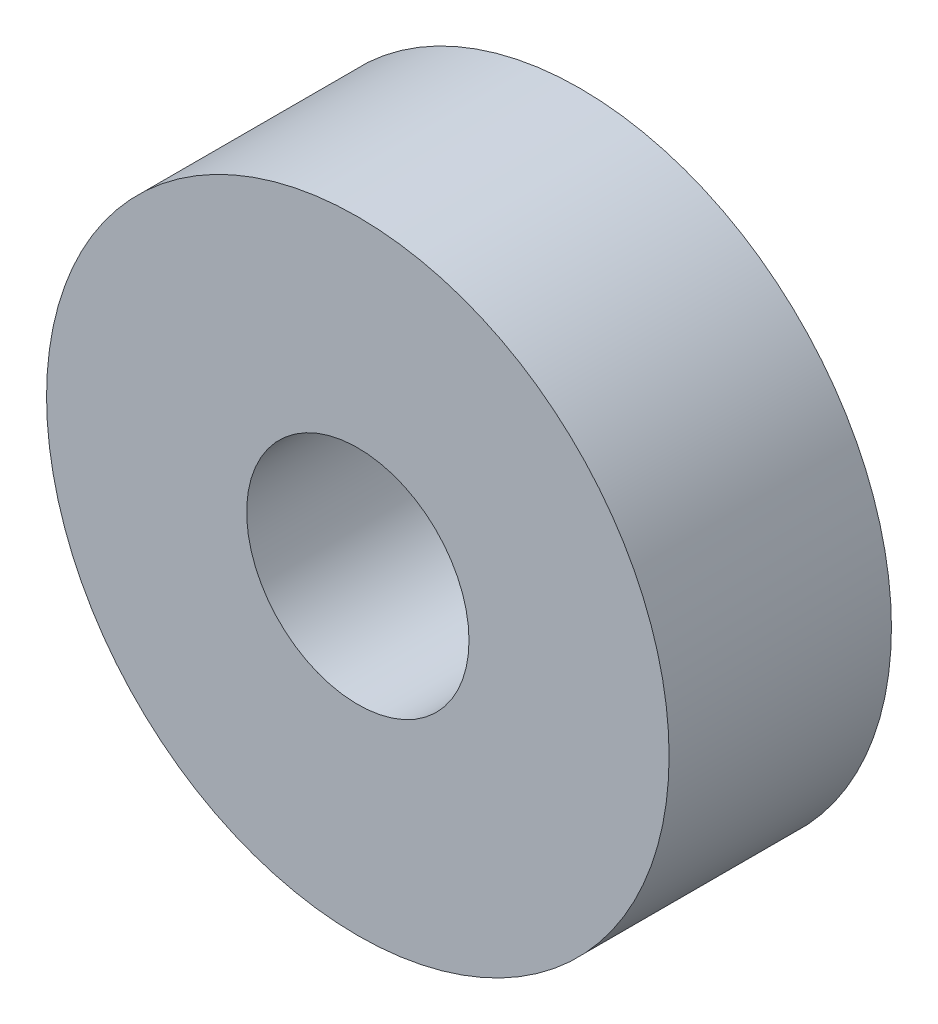
ISO-10303-21;
HEADER;
FILE_DESCRIPTION(('STEP AP214'),'2;1');
FILE_NAME('part.step','',(''),(''),'','','');
FILE_SCHEMA(('AUTOMOTIVE_DESIGN { 1 0 10303 214 1 1 1 1 }'));
ENDSEC;
DATA;
#1=APPLICATION_CONTEXT('core data for automotive mechanical design processes');
#2=APPLICATION_PROTOCOL_DEFINITION('international standard','automotive_design',2000,#1);
#3=PRODUCT_CONTEXT('',#1,'mechanical');
#4=PRODUCT('Part','Part','',(#3));
#5=PRODUCT_RELATED_PRODUCT_CATEGORY('part','',(#4));
#6=PRODUCT_DEFINITION_FORMATION('','',#4);
#7=PRODUCT_DEFINITION_CONTEXT('part definition',#1,'design');
#8=PRODUCT_DEFINITION('design','',#6,#7);
#9=PRODUCT_DEFINITION_SHAPE('','',#8);
#10=(LENGTH_UNIT() NAMED_UNIT(*) SI_UNIT(.MILLI.,.METRE.));
#11=(NAMED_UNIT(*) PLANE_ANGLE_UNIT() SI_UNIT($,.RADIAN.));
#12=(NAMED_UNIT(*) SI_UNIT($,.STERADIAN.) SOLID_ANGLE_UNIT());
#13=UNCERTAINTY_MEASURE_WITH_UNIT(LENGTH_MEASURE(1.E-05),#10,'distance_accuracy_value','');
#14=(GEOMETRIC_REPRESENTATION_CONTEXT(3) GLOBAL_UNCERTAINTY_ASSIGNED_CONTEXT((#13)) GLOBAL_UNIT_ASSIGNED_CONTEXT((#10,
#11,#12)) REPRESENTATION_CONTEXT('',''));
#15=CARTESIAN_POINT('',(0.,0.,0.));
#16=DIRECTION('',(0.,0.,1.));
#17=DIRECTION('',(1.,0.,0.));
#18=AXIS2_PLACEMENT_3D('',#15,#16,#17);
#19=CARTESIAN_POINT('',(0.,0.,5.));
#20=DIRECTION('',(0.,0.,1.));
#21=DIRECTION('',(1.,0.,0.));
#22=AXIS2_PLACEMENT_3D('',#19,#20,#21);
#23=PLANE('',#22);
#24=CARTESIAN_POINT('',(0.,0.,5.));
#25=DIRECTION('',(0.,0.,1.));
#26=DIRECTION('',(1.,0.,0.));
#27=AXIS2_PLACEMENT_3D('',#24,#25,#26);
#28=CIRCLE('',#27,7.);
#29=CARTESIAN_POINT('',(7.,0.,5.));
#30=VERTEX_POINT('',#29);
#31=EDGE_CURVE('E10',#30,#30,#28,.T.);
#32=ORIENTED_EDGE('',*,*,#31,.T.);
#33=EDGE_LOOP('',(#32));
#34=FACE_BOUND('',#33,.T.);
#35=CARTESIAN_POINT('',(0.,0.,5.));
#36=DIRECTION('',(0.,0.,1.));
#37=DIRECTION('',(1.,0.,0.));
#38=AXIS2_PLACEMENT_3D('',#35,#36,#37);
#39=CIRCLE('',#38,2.5);
#40=CARTESIAN_POINT('',(2.5,0.,5.));
#41=VERTEX_POINT('',#40);
#42=EDGE_CURVE('E44',#41,#41,#39,.T.);
#43=ORIENTED_EDGE('',*,*,#42,.F.);
#44=EDGE_LOOP('',(#43));
#45=FACE_BOUND('',#44,.T.);
#46=ADVANCED_FACE('F32',(#34,#45),#23,.T.);
#47=CARTESIAN_POINT('',(0.,0.,0.));
#48=DIRECTION('',(0.,0.,1.));
#49=DIRECTION('',(1.,0.,0.));
#50=AXIS2_PLACEMENT_3D('',#47,#48,#49);
#51=PLANE('',#50);
#52=CARTESIAN_POINT('',(0.,0.,0.));
#53=DIRECTION('',(0.,0.,1.));
#54=DIRECTION('',(1.,0.,0.));
#55=AXIS2_PLACEMENT_3D('',#52,#53,#54);
#56=CIRCLE('',#55,7.);
#57=CARTESIAN_POINT('',(7.,0.,0.));
#58=VERTEX_POINT('',#57);
#59=EDGE_CURVE('E36',#58,#58,#56,.T.);
#60=ORIENTED_EDGE('',*,*,#59,.F.);
#61=EDGE_LOOP('',(#60));
#62=FACE_BOUND('',#61,.T.);
#63=CARTESIAN_POINT('',(0.,0.,0.));
#64=DIRECTION('',(0.,0.,1.));
#65=DIRECTION('',(1.,0.,0.));
#66=AXIS2_PLACEMENT_3D('',#63,#64,#65);
#67=CIRCLE('',#66,2.5);
#68=CARTESIAN_POINT('',(2.5,0.,0.));
#69=VERTEX_POINT('',#68);
#70=EDGE_CURVE('E46',#69,#69,#67,.T.);
#71=ORIENTED_EDGE('',*,*,#70,.T.);
#72=EDGE_LOOP('',(#71));
#73=FACE_BOUND('',#72,.T.);
#74=ADVANCED_FACE('F56',(#62,#73),#51,.F.);
#75=CARTESIAN_POINT('',(0.,0.,5.));
#76=DIRECTION('',(0.,0.,-1.));
#77=DIRECTION('',(-1.,0.,0.));
#78=AXIS2_PLACEMENT_3D('',#75,#76,#77);
#79=CYLINDRICAL_SURFACE('',#78,7.);
#80=ORIENTED_EDGE('',*,*,#31,.F.);
#81=EDGE_LOOP('',(#80));
#82=FACE_BOUND('',#81,.T.);
#83=ORIENTED_EDGE('',*,*,#59,.T.);
#84=EDGE_LOOP('',(#83));
#85=FACE_BOUND('',#84,.T.);
#86=ADVANCED_FACE('F34',(#82,#85),#79,.T.);
#87=CARTESIAN_POINT('',(0.,0.,5.));
#88=DIRECTION('',(0.,0.,-1.));
#89=DIRECTION('',(-1.,0.,0.));
#90=AXIS2_PLACEMENT_3D('',#87,#88,#89);
#91=CYLINDRICAL_SURFACE('',#90,2.5);
#92=ORIENTED_EDGE('',*,*,#42,.T.);
#93=EDGE_LOOP('',(#92));
#94=FACE_BOUND('',#93,.T.);
#95=ORIENTED_EDGE('',*,*,#70,.F.);
#96=EDGE_LOOP('',(#95));
#97=FACE_BOUND('',#96,.T.);
#98=ADVANCED_FACE('F52',(#94,#97),#91,.F.);
#99=CLOSED_SHELL('',(#46,#74,#86,#98));
#100=MANIFOLD_SOLID_BREP('B2',#99);
#101=ADVANCED_BREP_SHAPE_REPRESENTATION('',(#18,#100),#14);
#102=SHAPE_DEFINITION_REPRESENTATION(#9,#101);
ENDSEC;
END-ISO-10303-21;
